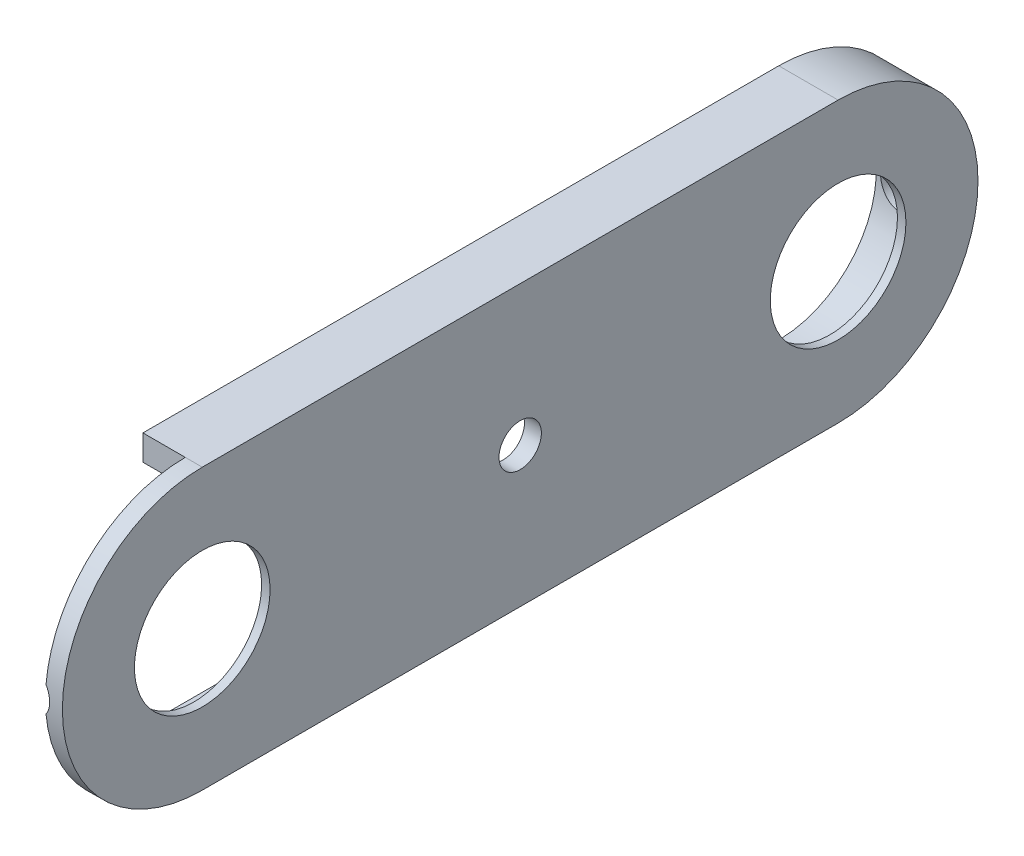
ISO-10303-21;
HEADER;
FILE_DESCRIPTION(('STEP AP214'),'2;1');
FILE_NAME('part.step','',(''),(''),'','','');
FILE_SCHEMA(('AUTOMOTIVE_DESIGN { 1 0 10303 214 1 1 1 1 }'));
ENDSEC;
DATA;
#1=APPLICATION_CONTEXT('core data for automotive mechanical design processes');
#2=APPLICATION_PROTOCOL_DEFINITION('international standard','automotive_design',2000,#1);
#3=PRODUCT_CONTEXT('',#1,'mechanical');
#4=PRODUCT('Part','Part','',(#3));
#5=PRODUCT_RELATED_PRODUCT_CATEGORY('part','',(#4));
#6=PRODUCT_DEFINITION_FORMATION('','',#4);
#7=PRODUCT_DEFINITION_CONTEXT('part definition',#1,'design');
#8=PRODUCT_DEFINITION('design','',#6,#7);
#9=PRODUCT_DEFINITION_SHAPE('','',#8);
#10=(LENGTH_UNIT() NAMED_UNIT(*) SI_UNIT(.MILLI.,.METRE.));
#11=(NAMED_UNIT(*) PLANE_ANGLE_UNIT() SI_UNIT($,.RADIAN.));
#12=(NAMED_UNIT(*) SI_UNIT($,.STERADIAN.) SOLID_ANGLE_UNIT());
#13=UNCERTAINTY_MEASURE_WITH_UNIT(LENGTH_MEASURE(1.E-05),#10,'distance_accuracy_value','');
#14=(GEOMETRIC_REPRESENTATION_CONTEXT(3) GLOBAL_UNCERTAINTY_ASSIGNED_CONTEXT((#13)) GLOBAL_UNIT_ASSIGNED_CONTEXT((#10,
#11,#12)) REPRESENTATION_CONTEXT('',''));
#15=CARTESIAN_POINT('',(0.,0.,0.));
#16=DIRECTION('',(0.,0.,1.));
#17=DIRECTION('',(1.,0.,0.));
#18=AXIS2_PLACEMENT_3D('',#15,#16,#17);
#19=CARTESIAN_POINT('',(-1.,0.,-37.5));
#20=DIRECTION('',(1.,0.,0.));
#21=DIRECTION('',(0.,0.,-1.));
#22=AXIS2_PLACEMENT_3D('',#19,#20,#21);
#23=CYLINDRICAL_SURFACE('',#22,16.5);
#24=CARTESIAN_POINT('',(-1.,0.,-37.5));
#25=DIRECTION('',(-1.,0.,0.));
#26=DIRECTION('',(0.,0.,1.));
#27=AXIS2_PLACEMENT_3D('',#24,#25,#26);
#28=CIRCLE('',#27,16.5);
#29=CARTESIAN_POINT('',(-1.,-13.5,-28.0131670194948));
#30=VERTEX_POINT('',#29);
#31=CARTESIAN_POINT('',(-1.,13.5,-28.0131670194949));
#32=VERTEX_POINT('',#31);
#33=EDGE_CURVE('E54',#30,#32,#28,.T.);
#34=ORIENTED_EDGE('',*,*,#33,.T.);
#35=DIRECTION('',(1.,0.,0.));
#36=VECTOR('',#35,1.);
#37=CARTESIAN_POINT('',(-1.,13.5,-28.0131670194949));
#38=LINE('',#37,#36);
#39=CARTESIAN_POINT('',(-6.,13.5,-28.0131670194949));
#40=VERTEX_POINT('',#39);
#41=EDGE_CURVE('E155',#32,#40,#38,.F.);
#42=ORIENTED_EDGE('',*,*,#41,.T.);
#43=CARTESIAN_POINT('',(-6.,0.,-37.5));
#44=DIRECTION('',(-1.,0.,0.));
#45=DIRECTION('',(0.,0.,-1.));
#46=AXIS2_PLACEMENT_3D('',#43,#44,#45);
#47=CIRCLE('',#46,16.5);
#48=CARTESIAN_POINT('',(-6.,-13.5,-28.0131670194948));
#49=VERTEX_POINT('',#48);
#50=EDGE_CURVE('E148',#49,#40,#47,.T.);
#51=ORIENTED_EDGE('',*,*,#50,.F.);
#52=DIRECTION('',(1.,0.,0.));
#53=VECTOR('',#52,1.);
#54=CARTESIAN_POINT('',(-1.,-13.5,-28.0131670194948));
#55=LINE('',#54,#53);
#56=EDGE_CURVE('E174',#49,#30,#55,.T.);
#57=ORIENTED_EDGE('',*,*,#56,.T.);
#58=EDGE_LOOP('',(#34,#42,#51,#57));
#59=FACE_BOUND('',#58,.T.);
#60=ADVANCED_FACE('F39',(#59),#23,.T.);
#61=CARTESIAN_POINT('',(-1.,0.,-37.5));
#62=DIRECTION('',(-1.,0.,0.));
#63=DIRECTION('',(0.,0.,1.));
#64=AXIS2_PLACEMENT_3D('',#61,#62,#63);
#65=PLANE('',#64);
#66=CARTESIAN_POINT('',(-1.,0.,0.));
#67=DIRECTION('',(-1.,0.,0.));
#68=DIRECTION('',(0.,0.,1.));
#69=AXIS2_PLACEMENT_3D('',#66,#67,#68);
#70=CIRCLE('',#69,2.5);
#71=CARTESIAN_POINT('',(-1.,0.,2.5));
#72=VERTEX_POINT('',#71);
#73=EDGE_CURVE('E181',#72,#72,#70,.T.);
#74=ORIENTED_EDGE('',*,*,#73,.F.);
#75=EDGE_LOOP('',(#74));
#76=FACE_BOUND('',#75,.T.);
#77=CARTESIAN_POINT('',(-1.,0.,37.5));
#78=DIRECTION('',(-1.,0.,0.));
#79=DIRECTION('',(0.,0.,1.));
#80=AXIS2_PLACEMENT_3D('',#77,#78,#79);
#81=CIRCLE('',#80,16.5);
#82=CARTESIAN_POINT('',(-1.,1.49999999999999,53.931676725155));
#83=VERTEX_POINT('',#82);
#84=CARTESIAN_POINT('',(-1.,16.5,37.5));
#85=VERTEX_POINT('',#84);
#86=EDGE_CURVE('E275',#83,#85,#81,.T.);
#87=ORIENTED_EDGE('',*,*,#86,.T.);
#88=DIRECTION('',(0.,1.,0.));
#89=VECTOR('',#88,1.);
#90=CARTESIAN_POINT('',(-1.,13.5,37.5));
#91=LINE('',#90,#89);
#92=CARTESIAN_POINT('',(-1.,13.5,37.5));
#93=VERTEX_POINT('',#92);
#94=EDGE_CURVE('E61',#93,#85,#91,.T.);
#95=ORIENTED_EDGE('',*,*,#94,.F.);
#96=DIRECTION('',(0.,0.,1.));
#97=VECTOR('',#96,1.);
#98=CARTESIAN_POINT('',(-1.,13.5,37.5));
#99=LINE('',#98,#97);
#100=EDGE_CURVE('E65',#32,#93,#99,.T.);
#101=ORIENTED_EDGE('',*,*,#100,.F.);
#102=ORIENTED_EDGE('',*,*,#33,.F.);
#103=DIRECTION('',(0.,0.,1.));
#104=VECTOR('',#103,1.);
#105=CARTESIAN_POINT('',(-1.,-13.5,37.5));
#106=LINE('',#105,#104);
#107=CARTESIAN_POINT('',(-1.,-13.5,37.5));
#108=VERTEX_POINT('',#107);
#109=EDGE_CURVE('E159',#30,#108,#106,.T.);
#110=ORIENTED_EDGE('',*,*,#109,.T.);
#111=DIRECTION('',(0.,-1.,0.));
#112=VECTOR('',#111,1.);
#113=CARTESIAN_POINT('',(-1.,-13.5,37.5));
#114=LINE('',#113,#112);
#115=CARTESIAN_POINT('',(-1.,-16.5,37.5));
#116=VERTEX_POINT('',#115);
#117=EDGE_CURVE('E167',#108,#116,#114,.T.);
#118=ORIENTED_EDGE('',*,*,#117,.T.);
#119=CARTESIAN_POINT('',(-1.,-1.50000000000001,53.931676725155));
#120=VERTEX_POINT('',#119);
#121=EDGE_CURVE('E270',#116,#120,#81,.T.);
#122=ORIENTED_EDGE('',*,*,#121,.T.);
#123=DIRECTION('',(0.,0.,1.));
#124=VECTOR('',#123,1.);
#125=CARTESIAN_POINT('',(-1.,-1.50000000000001,44.));
#126=LINE('',#125,#124);
#127=CARTESIAN_POINT('',(-1.,-1.50000000000001,48.9017542509914));
#128=VERTEX_POINT('',#127);
#129=EDGE_CURVE('E223',#128,#120,#126,.T.);
#130=ORIENTED_EDGE('',*,*,#129,.F.);
#131=CARTESIAN_POINT('',(-1.,0.,37.5));
#132=DIRECTION('',(-1.,0.,0.));
#133=DIRECTION('',(0.,0.,1.));
#134=AXIS2_PLACEMENT_3D('',#131,#132,#133);
#135=CIRCLE('',#134,11.5);
#136=CARTESIAN_POINT('',(-1.,1.49999999999999,48.9017542509914));
#137=VERTEX_POINT('',#136);
#138=EDGE_CURVE('E307',#137,#128,#135,.T.);
#139=ORIENTED_EDGE('',*,*,#138,.F.);
#140=DIRECTION('',(0.,0.,1.));
#141=VECTOR('',#140,1.);
#142=CARTESIAN_POINT('',(-1.,1.49999999999999,44.));
#143=LINE('',#142,#141);
#144=EDGE_CURVE('E190',#83,#137,#143,.F.);
#145=ORIENTED_EDGE('',*,*,#144,.F.);
#146=EDGE_LOOP('',(#87,#95,#101,#102,#110,#118,#122,#130,#139,#145));
#147=FACE_BOUND('',#146,.T.);
#148=ADVANCED_FACE('F243',(#76,#147),#65,.T.);
#149=CARTESIAN_POINT('',(-6.,16.5,-37.5));
#150=VERTEX_POINT('',#149);
#151=CARTESIAN_POINT('',(-6.,-16.5,-37.5));
#152=VERTEX_POINT('',#151);
#153=EDGE_CURVE('E257',#150,#152,#47,.T.);
#154=ORIENTED_EDGE('',*,*,#153,.F.);
#155=DIRECTION('',(1.,0.,0.));
#156=VECTOR('',#155,1.);
#157=CARTESIAN_POINT('',(-1.,16.5,-37.5));
#158=LINE('',#157,#156);
#159=CARTESIAN_POINT('',(1.,16.5,-37.5));
#160=VERTEX_POINT('',#159);
#161=EDGE_CURVE('E261',#150,#160,#158,.T.);
#162=ORIENTED_EDGE('',*,*,#161,.T.);
#163=CARTESIAN_POINT('',(1.,0.,-37.5));
#164=DIRECTION('',(1.,0.,0.));
#165=DIRECTION('',(0.,0.,-1.));
#166=AXIS2_PLACEMENT_3D('',#163,#164,#165);
#167=CIRCLE('',#166,16.5);
#168=CARTESIAN_POINT('',(1.,-16.5,-37.5));
#169=VERTEX_POINT('',#168);
#170=EDGE_CURVE('E293',#169,#160,#167,.T.);
#171=ORIENTED_EDGE('',*,*,#170,.F.);
#172=DIRECTION('',(1.,0.,0.));
#173=VECTOR('',#172,1.);
#174=CARTESIAN_POINT('',(-1.,-16.5,-37.5));
#175=LINE('',#174,#173);
#176=EDGE_CURVE('E263',#152,#169,#175,.T.);
#177=ORIENTED_EDGE('',*,*,#176,.F.);
#178=EDGE_LOOP('',(#154,#162,#171,#177));
#179=FACE_BOUND('',#178,.T.);
#180=CARTESIAN_POINT('',(-5.5,0.,-54.));
#181=CARTESIAN_POINT('',(-5.4999942572363,0.139568997452366,-53.9999977476528));
#182=CARTESIAN_POINT('',(-5.48827283785621,0.279218562999105,-53.9982105870402));
#183=CARTESIAN_POINT('',(-5.44170939028852,0.554613125820164,-53.9912532584451));
#184=CARTESIAN_POINT('',(-5.40684495841119,0.690354206485425,-53.9860798124227));
#185=CARTESIAN_POINT('',(-5.31506213885822,0.953906534647158,-53.9729311954606));
#186=CARTESIAN_POINT('',(-5.25816053949185,1.08172373291607,-53.9649581577308));
#187=CARTESIAN_POINT('',(-5.12395989708139,1.32597651388556,-53.9470909962824));
#188=CARTESIAN_POINT('',(-5.04666364327757,1.4424136499791,-53.9371971353109));
#189=CARTESIAN_POINT('',(-4.87321202367213,1.66154764510865,-53.9165001477212));
#190=CARTESIAN_POINT('',(-4.77692626445659,1.76414074029145,-53.9056910471797));
#191=CARTESIAN_POINT('',(-4.5685094321218,1.95177906511561,-53.8844285015251));
#192=CARTESIAN_POINT('',(-4.45637744082327,2.03682327721789,-53.8739750770647));
#193=CARTESIAN_POINT('',(-4.21875260905018,2.18735471298304,-53.8545494950682));
#194=CARTESIAN_POINT('',(-4.09319536151448,2.25274134816778,-53.8455850578477));
#195=CARTESIAN_POINT('',(-3.83272209459418,2.36145868570304,-53.8302341066754));
#196=CARTESIAN_POINT('',(-3.6978065962276,2.40479061482504,-53.8238474493412));
#197=CARTESIAN_POINT('',(-3.42353862923588,2.46784584311276,-53.8144339675493));
#198=CARTESIAN_POINT('',(-3.2842279161298,2.48774691974325,-53.8113818557403));
#199=CARTESIAN_POINT('',(-3.00421348508192,2.50392630256672,-53.8089062866292));
#200=CARTESIAN_POINT('',(-2.8635098492071,2.50020599229005,-53.8094826168053));
#201=CARTESIAN_POINT('',(-2.5859606207159,2.46939344901517,-53.8141756935549));
#202=CARTESIAN_POINT('',(-2.44909244963458,2.44249936435955,-53.8182624233836));
#203=CARTESIAN_POINT('',(-2.18183399736372,2.36641294577585,-53.8294689284976));
#204=CARTESIAN_POINT('',(-2.05144390294958,2.31721996934142,-53.8365887911774));
#205=CARTESIAN_POINT('',(-1.80024086434348,2.19772653963013,-53.8530924237126));
#206=CARTESIAN_POINT('',(-1.67946838888596,2.12734229942809,-53.8624851506325));
#207=CARTESIAN_POINT('',(-1.45137312485011,1.96752394760192,-53.8824697345079));
#208=CARTESIAN_POINT('',(-1.34405123741435,1.87808856069977,-53.8930616717158));
#209=CARTESIAN_POINT('',(-1.14475535435619,1.6816196910193,-53.9143837896878));
#210=CARTESIAN_POINT('',(-1.05294922327677,1.57441587736975,-53.9251142778832));
#211=CARTESIAN_POINT('',(-0.888605767714139,1.34603342177114,-53.9454040614798));
#212=CARTESIAN_POINT('',(-0.816068530737785,1.22485471636074,-53.954963351562));
#213=CARTESIAN_POINT('',(-0.692312719709886,0.971815721794951,-53.9718439483926));
#214=CARTESIAN_POINT('',(-0.641107260329662,0.839948920979357,-53.9791638776606));
#215=CARTESIAN_POINT('',(-0.561615330948155,0.569352134225966,-53.9907295183001));
#216=CARTESIAN_POINT('',(-0.533327279747371,0.430622622485678,-53.9949754417622));
#217=CARTESIAN_POINT('',(-0.500696752646798,0.151687057386773,-53.9998865423228));
#218=CARTESIAN_POINT('',(-0.496123526143796,0.0115085829881224,-54.0005862236411));
#219=CARTESIAN_POINT('',(-0.510439746372429,-0.267613344135319,-53.99841997884));
#220=CARTESIAN_POINT('',(-0.529328451567997,-0.406556835753097,-53.9955541654115));
#221=CARTESIAN_POINT('',(-0.589840469928919,-0.678564556456686,-53.9866002804077));
#222=CARTESIAN_POINT('',(-0.631351204939266,-0.811654400666293,-53.9805281695293));
#223=CARTESIAN_POINT('',(-0.735810114210089,-1.068985319601,-53.9658402835765));
#224=CARTESIAN_POINT('',(-0.79875931285276,-1.19322597114698,-53.9572243869563));
#225=CARTESIAN_POINT('',(-0.944848489983347,-1.43034535898606,-53.9383205169475));
#226=CARTESIAN_POINT('',(-1.02813464849603,-1.54313306605977,-53.9280206247268));
#227=CARTESIAN_POINT('',(-1.21233024823772,-1.75321276039239,-53.9069318528274));
#228=CARTESIAN_POINT('',(-1.3132407356299,-1.85050382712981,-53.8961429441494));
#229=CARTESIAN_POINT('',(-1.53084844946048,-2.02766949282495,-53.8751825194096));
#230=CARTESIAN_POINT('',(-1.64767236616349,-2.10738930198108,-53.8650170189504));
#231=CARTESIAN_POINT('',(-1.89318858259066,-2.24607312771053,-53.8465614341441));
#232=CARTESIAN_POINT('',(-2.02188055643501,-2.30503771397846,-53.8382712983238));
#233=CARTESIAN_POINT('',(-2.2870207267788,-2.40029812933786,-53.824548765394));
#234=CARTESIAN_POINT('',(-2.42343924331679,-2.43667503156285,-53.8191061589608));
#235=CARTESIAN_POINT('',(-2.70053813044287,-2.48598526128159,-53.8116678999976));
#236=CARTESIAN_POINT('',(-2.84121819949256,-2.49892024355462,-53.8096720041627));
#237=CARTESIAN_POINT('',(-3.12130372333183,-2.50093949887772,-53.8093623561848));
#238=CARTESIAN_POINT('',(-3.26070744269384,-2.49026717585729,-53.8110110265066));
#239=CARTESIAN_POINT('',(-3.53571292388188,-2.44589678006131,-53.8177230193832));
#240=CARTESIAN_POINT('',(-3.67131469229923,-2.41219874720726,-53.8227863360179));
#241=CARTESIAN_POINT('',(-3.93479725637777,-2.32282019861314,-53.8357438759955));
#242=CARTESIAN_POINT('',(-4.06268405670539,-2.2671570399103,-53.8436358636471));
#243=CARTESIAN_POINT('',(-4.30734302854094,-2.13545259703986,-53.8613641884847));
#244=CARTESIAN_POINT('',(-4.42411480811905,-2.05941059464868,-53.8712005941958));
#245=CARTESIAN_POINT('',(-4.64446507641858,-1.88822405811483,-53.8918301104082));
#246=CARTESIAN_POINT('',(-4.74790281870661,-1.79289935219715,-53.9026316636391));
#247=CARTESIAN_POINT('',(-4.93740004854685,-1.58623408357502,-53.9239042061856));
#248=CARTESIAN_POINT('',(-5.02345549413766,-1.47488980607091,-53.9343751181395));
#249=CARTESIAN_POINT('',(-5.1761785014693,-1.23860885534677,-53.9538739280201));
#250=CARTESIAN_POINT('',(-5.24273434386786,-1.11359928449035,-53.9628933823142));
#251=CARTESIAN_POINT('',(-5.35380463948338,-0.85409719580988,-53.9783903010556));
#252=CARTESIAN_POINT('',(-5.39834184517857,-0.719614631613493,-53.9848703880603));
#253=CARTESIAN_POINT('',(-5.45404467179081,-0.487113114828242,-53.9930848997806));
#254=CARTESIAN_POINT('',(-5.47125147372363,-0.390526922007692,-53.9956646973583));
#255=CARTESIAN_POINT('',(-5.49423108091855,-0.195973716996664,-53.9991230273835));
#256=CARTESIAN_POINT('',(-5.50000403262515,-0.0980067225076503,-54.0000015816204));
#257=CARTESIAN_POINT('',(-5.5,0.,-54.));
#258=B_SPLINE_CURVE_WITH_KNOTS('',3,(#180,#181,#182,#183,#184,#185,#186,#187,#188,#189,#190,
#191,#192,#193,#194,#195,#196,#197,#198,#199,#200,#201,#202,#203,#204,#205,#206,#207,#208,#209,
#210,#211,#212,#213,#214,#215,#216,#217,#218,#219,#220,#221,#222,#223,#224,#225,#226,#227,#228,
#229,#230,#231,#232,#233,#234,#235,#236,#237,#238,#239,#240,#241,#242,#243,#244,#245,#246,#247,
#248,#249,#250,#251,#252,#253,#254,#255,#256,#257),.UNSPECIFIED.,.T.,.F.,(4,2,2,2,2,2,2,2,2,2,2,
2,2,2,2,2,2,2,2,2,2,2,2,2,2,2,2,2,2,2,2,2,2,2,2,2,2,2,4),(0.,0.418348855154565,
0.837103286425347,1.25553932860404,1.67391817372421,2.09527670136871,2.51665965383641,
2.94016350706256,3.36364380072527,3.7838898713138,4.20411132785922,4.6207749206096,
5.03745051960789,5.45579571983414,5.87416893276729,6.29681313733767,6.7194592612518,
7.1423648438073,7.56524124526807,7.98399513729014,8.40273579454462,8.81941137619317,
9.23610687041355,9.65589057087304,10.0756991977627,10.4990700457283,10.9224292719976,
11.3442600315172,11.7660610125886,12.1835332910605,12.6010048457295,13.0181471691684,
13.4353041961335,13.8565557584487,14.2779051632636,14.701623409228,15.1249028952404,
15.4186753379532,15.7124440180106),.UNSPECIFIED.);
#259=CARTESIAN_POINT('',(-5.5,0.,-54.));
#260=VERTEX_POINT('',#259);
#261=EDGE_CURVE('E184',#260,#260,#258,.T.);
#262=ORIENTED_EDGE('',*,*,#261,.F.);
#263=EDGE_LOOP('',(#262));
#264=FACE_BOUND('',#263,.T.);
#265=ADVANCED_FACE('F41',(#179,#264),#23,.T.);
#266=CARTESIAN_POINT('',(-1.,0.,-37.5));
#267=DIRECTION('',(1.,0.,0.));
#268=DIRECTION('',(0.,0.,-1.));
#269=AXIS2_PLACEMENT_3D('',#266,#267,#268);
#270=CYLINDRICAL_SURFACE('',#269,11.5);
#271=CARTESIAN_POINT('',(-6.,0.,-37.5));
#272=DIRECTION('',(-1.,0.,0.));
#273=DIRECTION('',(0.,0.,1.));
#274=AXIS2_PLACEMENT_3D('',#271,#272,#273);
#275=CIRCLE('',#274,11.5);
#276=CARTESIAN_POINT('',(-6.,0.,-26.));
#277=VERTEX_POINT('',#276);
#278=EDGE_CURVE('E222',#277,#277,#275,.T.);
#279=ORIENTED_EDGE('',*,*,#278,.T.);
#280=EDGE_LOOP('',(#279));
#281=FACE_BOUND('',#280,.T.);
#282=CARTESIAN_POINT('',(0.,0.,-37.5));
#283=DIRECTION('',(-1.,0.,0.));
#284=DIRECTION('',(0.,0.,1.));
#285=AXIS2_PLACEMENT_3D('',#282,#283,#284);
#286=CIRCLE('',#285,11.5);
#287=CARTESIAN_POINT('',(0.,0.,-26.));
#288=VERTEX_POINT('',#287);
#289=EDGE_CURVE('E303',#288,#288,#286,.T.);
#290=ORIENTED_EDGE('',*,*,#289,.F.);
#291=EDGE_LOOP('',(#290));
#292=FACE_BOUND('',#291,.T.);
#293=CARTESIAN_POINT('',(-5.5,0.,-49.));
#294=CARTESIAN_POINT('',(-5.49999523494069,0.138677726510846,-48.9999974393954));
#295=CARTESIAN_POINT('',(-5.48842213463175,0.277413225798972,-48.9974660329192));
#296=CARTESIAN_POINT('',(-5.44248273452923,0.550944911814615,-48.9876122322648));
#297=CARTESIAN_POINT('',(-5.40810001235691,0.685738187177276,-48.9802863862567));
#298=CARTESIAN_POINT('',(-5.31766803793991,0.947392658892464,-48.9616595565263));
#299=CARTESIAN_POINT('',(-5.26164127977798,1.07426193195674,-48.9503627008652));
#300=CARTESIAN_POINT('',(-5.12958268035959,1.31679476574257,-48.9250137521665));
#301=CARTESIAN_POINT('',(-5.05355140618513,1.43245864398414,-48.9109617372342));
#302=CARTESIAN_POINT('',(-4.88236557894334,1.65113687017524,-48.8813931566709));
#303=CARTESIAN_POINT('',(-4.78695454047447,1.7539480226285,-48.8658586111771));
#304=CARTESIAN_POINT('',(-4.58026823483503,1.94224066057477,-48.8352028008011));
#305=CARTESIAN_POINT('',(-4.46899156829011,2.02772061581533,-48.8200815725146));
#306=CARTESIAN_POINT('',(-4.23223337862382,2.17981857275251,-48.7917873272943));
#307=CARTESIAN_POINT('',(-4.10661017052634,2.24622069514281,-48.7786373565009));
#308=CARTESIAN_POINT('',(-3.84565523667896,2.35689344435894,-48.7560323824766));
#309=CARTESIAN_POINT('',(-3.71032465874524,2.40116668282572,-48.7465769432475));
#310=CARTESIAN_POINT('',(-3.43599938442598,2.46565424770195,-48.7326146337362));
#311=CARTESIAN_POINT('',(-3.29709304326436,2.48622809682875,-48.7280338974079));
#312=CARTESIAN_POINT('',(-3.01773058213711,2.50385066868686,-48.724117758739));
#313=CARTESIAN_POINT('',(-2.87727465233032,2.50090224659726,-48.7247817197868));
#314=CARTESIAN_POINT('',(-2.60146966696417,2.47185339460594,-48.7312130658968));
#315=CARTESIAN_POINT('',(-2.46607419641681,2.44617020684332,-48.7368884732507));
#316=CARTESIAN_POINT('',(-2.20156088300032,2.37304173275475,-48.7525578586621));
#317=CARTESIAN_POINT('',(-2.07244338892178,2.32559523883172,-48.7625520763589));
#318=CARTESIAN_POINT('',(-1.82297605607061,2.20990273661165,-48.7858238749824));
#319=CARTESIAN_POINT('',(-1.70270324141853,2.14149592741319,-48.799126684358));
#320=CARTESIAN_POINT('',(-1.47518910877612,1.98593770795307,-48.8275012480038));
#321=CARTESIAN_POINT('',(-1.36794954970688,1.89878377203338,-48.8425732404982));
#322=CARTESIAN_POINT('',(-1.16714347213638,1.70599474463954,-48.8731828590882));
#323=CARTESIAN_POINT('',(-1.07391781330583,1.60000476027814,-48.8887235557419));
#324=CARTESIAN_POINT('',(-0.906509659135693,1.37371962098244,-48.9182263347737));
#325=CARTESIAN_POINT('',(-0.832327500647488,1.25342421306141,-48.9321883892255));
#326=CARTESIAN_POINT('',(-0.705029453344621,1.00152969205098,-48.9570051935705));
#327=CARTESIAN_POINT('',(-0.651957806859073,0.869907535370165,-48.9678534045306));
#328=CARTESIAN_POINT('',(-0.568779226409146,0.599325426676384,-48.9851715489049));
#329=CARTESIAN_POINT('',(-0.538668994554443,0.460366531487377,-48.9916421110548));
#330=CARTESIAN_POINT('',(-0.502762761776951,0.181979668046687,-48.9993865515895));
#331=CARTESIAN_POINT('',(-0.49650108001959,0.0426144524251206,-49.0007599464758));
#332=CARTESIAN_POINT('',(-0.507208085243221,-0.2351706651068,-48.9984339982112));
#333=CARTESIAN_POINT('',(-0.52417521678492,-0.373590629688975,-48.9947349947164));
#334=CARTESIAN_POINT('',(-0.580472011817674,-0.644016073384047,-48.9827426393966));
#335=CARTESIAN_POINT('',(-0.619557816836417,-0.776074738455781,-48.974499412859));
#336=CARTESIAN_POINT('',(-0.718712094390643,-1.03176169777679,-48.9543411035207));
#337=CARTESIAN_POINT('',(-0.778782339473739,-1.15538927880089,-48.9424257105435));
#338=CARTESIAN_POINT('',(-0.919173336488136,-1.39263316867793,-48.9159991010029));
#339=CARTESIAN_POINT('',(-0.999768162646761,-1.50608338755975,-48.9014535932093));
#340=CARTESIAN_POINT('',(-1.17855917395209,-1.71801618519105,-48.8714509636298));
#341=CARTESIAN_POINT('',(-1.27675761530829,-1.81649684233745,-48.8559937251605));
#342=CARTESIAN_POINT('',(-1.49010405467798,-1.99753288574289,-48.825566641818));
#343=CARTESIAN_POINT('',(-1.60552787262532,-2.07976600786433,-48.810610776988));
#344=CARTESIAN_POINT('',(-1.84882151902335,-2.22368179366392,-48.7832011420601));
#345=CARTESIAN_POINT('',(-1.97669081094422,-2.2853653427365,-48.7707472641715));
#346=CARTESIAN_POINT('',(-2.24056216950365,-2.38601708061677,-48.7498696486682));
#347=CARTESIAN_POINT('',(-2.37651388040793,-2.42511238575492,-48.7414234069624));
#348=CARTESIAN_POINT('',(-2.65326393460487,-2.47985131583717,-48.7294762446113));
#349=CARTESIAN_POINT('',(-2.7940615101344,-2.49549863846582,-48.7259745442301));
#350=CARTESIAN_POINT('',(-3.07325831791543,-2.50274155792605,-48.7243616472795));
#351=CARTESIAN_POINT('',(-3.21164388207539,-2.49484798386679,-48.7261359606195));
#352=CARTESIAN_POINT('',(-3.48506257440381,-2.45637409896548,-48.7346164742396));
#353=CARTESIAN_POINT('',(-3.62009574106628,-2.42579404874617,-48.7413226178626));
#354=CARTESIAN_POINT('',(-3.88257674431773,-2.34306069762794,-48.7588557046026));
#355=CARTESIAN_POINT('',(-4.0100487415331,-2.2909808755088,-48.7696686022834));
#356=CARTESIAN_POINT('',(-4.25452202840861,-2.16678978132846,-48.7942025369604));
#357=CARTESIAN_POINT('',(-4.37152224091074,-2.09467645168668,-48.8079238726391));
#358=CARTESIAN_POINT('',(-4.59425083236039,-1.93076731772527,-48.8370712566148));
#359=CARTESIAN_POINT('',(-4.69970734417471,-1.83860709857685,-48.8525258838354));
#360=CARTESIAN_POINT('',(-4.89382607594413,-1.63795982288562,-48.8832055192048));
#361=CARTESIAN_POINT('',(-4.98248441057393,-1.52946899955169,-48.8984304734839));
#362=CARTESIAN_POINT('',(-5.14157383582102,-1.29756952312689,-48.9271660141609));
#363=CARTESIAN_POINT('',(-5.21175748905955,-1.17398793223283,-48.9406522029584));
#364=CARTESIAN_POINT('',(-5.33024581960981,-0.916515832604882,-48.9641462926135));
#365=CARTESIAN_POINT('',(-5.37856894784688,-0.782634129577186,-48.9741571251076));
#366=CARTESIAN_POINT('',(-5.44329680567228,-0.540505002079868,-48.9877745785232));
#367=CARTESIAN_POINT('',(-5.46452013128871,-0.433572829583115,-48.9923308317923));
#368=CARTESIAN_POINT('',(-5.49287329436757,-0.217772258186681,-48.9984444830369));
#369=CARTESIAN_POINT('',(-5.50000374201223,-0.108903943322497,-49.0000020108488));
#370=CARTESIAN_POINT('',(-5.5,0.,-49.));
#371=B_SPLINE_CURVE_WITH_KNOTS('',3,(#293,#294,#295,#296,#297,#298,#299,#300,#301,#302,#303,
#304,#305,#306,#307,#308,#309,#310,#311,#312,#313,#314,#315,#316,#317,#318,#319,#320,#321,#322,
#323,#324,#325,#326,#327,#328,#329,#330,#331,#332,#333,#334,#335,#336,#337,#338,#339,#340,#341,
#342,#343,#344,#345,#346,#347,#348,#349,#350,#351,#352,#353,#354,#355,#356,#357,#358,#359,#360,
#361,#362,#363,#364,#365,#366,#367,#368,#369,#370),.UNSPECIFIED.,.T.,.F.,(4,2,2,2,2,2,2,2,2,2,2,
2,2,2,2,2,2,2,2,2,2,2,2,2,2,2,2,2,2,2,2,2,2,2,2,2,2,2,4),(0.,0.415634564336815,
0.831568700793521,1.24707172561509,1.66256297315069,2.08396070666695,2.50539563117213,
2.93142680189745,3.35740768073597,3.77683755102814,4.19621651088048,4.60805475084517,
5.01991584555554,5.43501926087916,5.85017863499904,6.27420298213809,6.69823482912454,
7.12315071646025,7.54800556269352,7.96452059893772,8.38100774601865,8.79299016056121,
9.20500738351862,9.62284481100338,10.0407358299606,10.4662282557997,10.8917023465929,
11.3147581376294,11.7377472068679,12.151624822884,12.5654976843385,12.9779676302157,
13.390479955298,13.8112329668628,14.2320831777846,14.6583121167758,15.0841806317309,
15.4105935613292,15.73699235785),.UNSPECIFIED.);
#372=CARTESIAN_POINT('',(-5.5,0.,-49.));
#373=VERTEX_POINT('',#372);
#374=EDGE_CURVE('E44',#373,#373,#371,.T.);
#375=ORIENTED_EDGE('',*,*,#374,.T.);
#376=EDGE_LOOP('',(#375));
#377=FACE_BOUND('',#376,.T.);
#378=ADVANCED_FACE('F234',(#281,#292,#377),#270,.F.);
#379=CARTESIAN_POINT('',(-1.,-16.5,-37.5));
#380=DIRECTION('',(0.,1.,0.));
#381=DIRECTION('',(0.,0.,1.));
#382=AXIS2_PLACEMENT_3D('',#379,#380,#381);
#383=PLANE('',#382);
#384=ORIENTED_EDGE('',*,*,#176,.T.);
#385=DIRECTION('',(0.,0.,-1.));
#386=VECTOR('',#385,1.);
#387=CARTESIAN_POINT('',(1.,-16.5,37.5));
#388=LINE('',#387,#386);
#389=CARTESIAN_POINT('',(1.,-16.5,37.5));
#390=VERTEX_POINT('',#389);
#391=EDGE_CURVE('E301',#390,#169,#388,.T.);
#392=ORIENTED_EDGE('',*,*,#391,.F.);
#393=DIRECTION('',(1.,0.,0.));
#394=VECTOR('',#393,1.);
#395=CARTESIAN_POINT('',(-1.,-16.5,37.5));
#396=LINE('',#395,#394);
#397=EDGE_CURVE('E272',#116,#390,#396,.T.);
#398=ORIENTED_EDGE('',*,*,#397,.F.);
#399=DIRECTION('',(-1.,0.,0.));
#400=VECTOR('',#399,1.);
#401=CARTESIAN_POINT('',(-1.,-16.5,37.5));
#402=LINE('',#401,#400);
#403=CARTESIAN_POINT('',(-6.,-16.5,37.5));
#404=VERTEX_POINT('',#403);
#405=EDGE_CURVE('E158',#116,#404,#402,.T.);
#406=ORIENTED_EDGE('',*,*,#405,.T.);
#407=DIRECTION('',(0.,0.,-1.));
#408=VECTOR('',#407,1.);
#409=CARTESIAN_POINT('',(-6.,-16.5,37.5));
#410=LINE('',#409,#408);
#411=EDGE_CURVE('E162',#404,#152,#410,.T.);
#412=ORIENTED_EDGE('',*,*,#411,.T.);
#413=EDGE_LOOP('',(#384,#392,#398,#406,#412));
#414=FACE_BOUND('',#413,.T.);
#415=ADVANCED_FACE('F230',(#414),#383,.F.);
#416=CARTESIAN_POINT('',(-1.,0.,37.5));
#417=DIRECTION('',(1.,0.,0.));
#418=DIRECTION('',(0.,0.,-1.));
#419=AXIS2_PLACEMENT_3D('',#416,#417,#418);
#420=CYLINDRICAL_SURFACE('',#419,16.5);
#421=ORIENTED_EDGE('',*,*,#86,.F.);
#422=CARTESIAN_POINT('',(-1.,1.49999999999999,53.931676725155));
#423=CARTESIAN_POINT('',(-0.958043236503979,1.44406823161597,53.9367847242388));
#424=CARTESIAN_POINT('',(-0.918438470805411,1.38636261476401,53.941762481247));
#425=CARTESIAN_POINT('',(-0.844184058788926,1.26780998175513,53.9513274895686));
#426=CARTESIAN_POINT('',(-0.809534792389235,1.20696272522751,53.9559147109303));
#427=CARTESIAN_POINT('',(-0.745475832155907,1.08259388150965,53.9645641820903));
#428=CARTESIAN_POINT('',(-0.71606177679017,1.01907457551408,53.9686268681045));
#429=CARTESIAN_POINT('',(-0.662655228978226,0.889784635140983,53.9761186387628));
#430=CARTESIAN_POINT('',(-0.638662181921425,0.82401423186141,53.979547788216));
#431=CARTESIAN_POINT('',(-0.578658432326006,0.635207732990263,53.9882196069889));
#432=CARTESIAN_POINT('',(-0.549211970659786,0.509969171209201,53.9926037501661));
#433=CARTESIAN_POINT('',(-0.509884026072218,0.256495189217416,53.9984940243546));
#434=CARTESIAN_POINT('',(-0.499995781385175,0.128260820251451,54.0000011500167));
#435=CARTESIAN_POINT('',(-0.500004592168658,-0.139618178688662,53.9999987481505));
#436=CARTESIAN_POINT('',(-0.511731147671445,-0.27926770053111,53.9982102819677));
#437=CARTESIAN_POINT('',(-0.558300080267756,-0.554643526989207,53.9912515523376));
#438=CARTESIAN_POINT('',(-0.593158202707852,-0.690367093543215,53.9860789854122));
#439=CARTESIAN_POINT('',(-0.68138508601964,-0.943701307303994,53.9734405036184));
#440=CARTESIAN_POINT('',(-0.733095918533016,-1.06189876078266,53.9661852015175));
#441=CARTESIAN_POINT('',(-0.823688287245206,-1.23199244953415,53.954040406207));
#442=CARTESIAN_POINT('',(-0.856056322765056,-1.28748934230919,53.9497818894977));
#443=CARTESIAN_POINT('',(-0.924953319114893,-1.39581465794437,53.9409444576576));
#444=CARTESIAN_POINT('',(-0.961482491317521,-1.44864294505082,53.9363655262552));
#445=CARTESIAN_POINT('',(-1.,-1.50000000000001,53.931676725155));
#446=B_SPLINE_CURVE_WITH_KNOTS('',3,(#422,#423,#424,#425,#426,#427,#428,#429,#430,#431,#432,
#433,#434,#435,#436,#437,#438,#439,#440,#441,#442,#443,#444,#445),.UNSPECIFIED.,.F.,.F.,(4,2,2,
2,2,2,2,2,2,2,2,4),(0.,0.210252469290647,0.420521049162741,0.630613622706148,0.840684692430633,
1.22519090257139,1.60956415602862,2.02797324992905,2.44666744181691,2.83266814472569,
3.02566412107014,3.21866990537779),.UNSPECIFIED.);
#447=EDGE_CURVE('E215',#83,#120,#446,.T.);
#448=ORIENTED_EDGE('',*,*,#447,.T.);
#449=ORIENTED_EDGE('',*,*,#121,.F.);
#450=ORIENTED_EDGE('',*,*,#397,.T.);
#451=CARTESIAN_POINT('',(1.,0.,37.5));
#452=DIRECTION('',(1.,0.,0.));
#453=DIRECTION('',(0.,0.,-1.));
#454=AXIS2_PLACEMENT_3D('',#451,#452,#453);
#455=CIRCLE('',#454,16.5);
#456=CARTESIAN_POINT('',(1.,16.5,37.5));
#457=VERTEX_POINT('',#456);
#458=EDGE_CURVE('E298',#457,#390,#455,.T.);
#459=ORIENTED_EDGE('',*,*,#458,.F.);
#460=DIRECTION('',(1.,0.,0.));
#461=VECTOR('',#460,1.);
#462=CARTESIAN_POINT('',(-1.,16.5,37.5));
#463=LINE('',#462,#461);
#464=EDGE_CURVE('E269',#85,#457,#463,.T.);
#465=ORIENTED_EDGE('',*,*,#464,.F.);
#466=EDGE_LOOP('',(#421,#448,#449,#450,#459,#465));
#467=FACE_BOUND('',#466,.T.);
#468=ADVANCED_FACE('F225',(#467),#420,.T.);
#469=CARTESIAN_POINT('',(-1.,16.5,-37.5));
#470=DIRECTION('',(0.,-1.,0.));
#471=DIRECTION('',(0.,0.,-1.));
#472=AXIS2_PLACEMENT_3D('',#469,#470,#471);
#473=PLANE('',#472);
#474=ORIENTED_EDGE('',*,*,#464,.T.);
#475=DIRECTION('',(0.,0.,1.));
#476=VECTOR('',#475,1.);
#477=CARTESIAN_POINT('',(1.,16.5,-37.5));
#478=LINE('',#477,#476);
#479=EDGE_CURVE('E267',#160,#457,#478,.T.);
#480=ORIENTED_EDGE('',*,*,#479,.F.);
#481=ORIENTED_EDGE('',*,*,#161,.F.);
#482=DIRECTION('',(0.,0.,-1.));
#483=VECTOR('',#482,1.);
#484=CARTESIAN_POINT('',(-6.,16.5,37.5));
#485=LINE('',#484,#483);
#486=CARTESIAN_POINT('',(-6.,16.5,37.5));
#487=VERTEX_POINT('',#486);
#488=EDGE_CURVE('E152',#487,#150,#485,.T.);
#489=ORIENTED_EDGE('',*,*,#488,.F.);
#490=DIRECTION('',(-1.,0.,0.));
#491=VECTOR('',#490,1.);
#492=CARTESIAN_POINT('',(-1.,16.5,37.5));
#493=LINE('',#492,#491);
#494=EDGE_CURVE('E139',#85,#487,#493,.T.);
#495=ORIENTED_EDGE('',*,*,#494,.F.);
#496=EDGE_LOOP('',(#474,#480,#481,#489,#495));
#497=FACE_BOUND('',#496,.T.);
#498=ADVANCED_FACE('F229',(#497),#473,.F.);
#499=CARTESIAN_POINT('',(-1.,0.,37.5));
#500=DIRECTION('',(1.,0.,0.));
#501=DIRECTION('',(0.,0.,-1.));
#502=AXIS2_PLACEMENT_3D('',#499,#500,#501);
#503=CYLINDRICAL_SURFACE('',#502,11.5);
#504=CARTESIAN_POINT('',(-1.,1.49999999999999,48.9017542509914));
#505=CARTESIAN_POINT('',(-0.958310899006862,1.44441220957512,48.909068204031));
#506=CARTESIAN_POINT('',(-0.918945586453826,1.38709633572446,48.9161935345548));
#507=CARTESIAN_POINT('',(-0.845093087546672,1.26933579130058,48.9298863995893));
#508=CARTESIAN_POINT('',(-0.810606209738207,1.20889092315827,48.9364538988084));
#509=CARTESIAN_POINT('',(-0.714855453680181,1.02344012901295,48.9550398753771));
#510=CARTESIAN_POINT('',(-0.661250136597802,0.894249532367522,48.9659511758814));
#511=CARTESIAN_POINT('',(-0.576237241760256,0.628403938762188,48.9835918793588));
#512=CARTESIAN_POINT('',(-0.544851754019787,0.491741658720796,48.990317119928));
#513=CARTESIAN_POINT('',(-0.505351576988069,0.215020655230268,48.9988213389508));
#514=CARTESIAN_POINT('',(-0.497219448575773,0.0749645565563675,49.0006040240994));
#515=CARTESIAN_POINT('',(-0.504408791601707,-0.202570414555329,48.9990420624589));
#516=CARTESIAN_POINT('',(-0.519408835454327,-0.340058218213022,48.9957676839556));
#517=CARTESIAN_POINT('',(-0.571792895831139,-0.610572920004494,48.984578276339));
#518=CARTESIAN_POINT('',(-0.609187847031189,-0.743597605419963,48.9766609802852));
#519=CARTESIAN_POINT('',(-0.699034921413499,-0.98485206513163,48.9583064320703));
#520=CARTESIAN_POINT('',(-0.74893422415527,-1.09407125857565,48.9483238187884));
#521=CARTESIAN_POINT('',(-0.834950886032945,-1.25145542802612,48.931826255262));
#522=CARTESIAN_POINT('',(-0.865472429931627,-1.30282675842697,48.9260752845494));
#523=CARTESIAN_POINT('',(-0.930091670120862,-1.40322548848979,48.9141804328814));
#524=CARTESIAN_POINT('',(-0.964189568638501,-1.45225275537684,48.9080365297149));
#525=CARTESIAN_POINT('',(-1.,-1.50000000000001,48.9017542509914));
#526=B_SPLINE_CURVE_WITH_KNOTS('',3,(#504,#505,#506,#507,#508,#509,#510,#511,#512,#513,#514,
#515,#516,#517,#518,#519,#520,#521,#522,#523,#524,#525),.UNSPECIFIED.,.F.,.F.,(4,2,2,2,2,2,2,2,
2,2,4),(0.,0.209478675176845,0.418970593302954,0.837699409106452,1.25684392504052,
1.67567401623285,2.0887365741673,2.50200098120147,2.86215255133374,3.04210911585093,
3.22207586161005),.UNSPECIFIED.);
#527=EDGE_CURVE('E11',#137,#128,#526,.T.);
#528=ORIENTED_EDGE('',*,*,#527,.F.);
#529=ORIENTED_EDGE('',*,*,#138,.T.);
#530=EDGE_LOOP('',(#528,#529));
#531=FACE_BOUND('',#530,.T.);
#532=CARTESIAN_POINT('',(0.,0.,37.5));
#533=DIRECTION('',(-1.,0.,0.));
#534=DIRECTION('',(0.,0.,1.));
#535=AXIS2_PLACEMENT_3D('',#532,#533,#534);
#536=CIRCLE('',#535,11.5);
#537=CARTESIAN_POINT('',(0.,0.,49.));
#538=VERTEX_POINT('',#537);
#539=EDGE_CURVE('E306',#538,#538,#536,.T.);
#540=ORIENTED_EDGE('',*,*,#539,.F.);
#541=EDGE_LOOP('',(#540));
#542=FACE_BOUND('',#541,.T.);
#543=ADVANCED_FACE('F314',(#531,#542),#503,.F.);
#544=CARTESIAN_POINT('',(0.,0.,-37.5));
#545=DIRECTION('',(1.,0.,0.));
#546=DIRECTION('',(0.,0.,-1.));
#547=AXIS2_PLACEMENT_3D('',#544,#545,#546);
#548=PLANE('',#547);
#549=CARTESIAN_POINT('',(0.,0.,37.5));
#550=DIRECTION('',(1.,0.,0.));
#551=DIRECTION('',(0.,0.,-1.));
#552=AXIS2_PLACEMENT_3D('',#549,#550,#551);
#553=CIRCLE('',#552,8.);
#554=CARTESIAN_POINT('',(0.,0.,29.5));
#555=VERTEX_POINT('',#554);
#556=EDGE_CURVE('E286',#555,#555,#553,.T.);
#557=ORIENTED_EDGE('',*,*,#556,.T.);
#558=EDGE_LOOP('',(#557));
#559=FACE_BOUND('',#558,.T.);
#560=ORIENTED_EDGE('',*,*,#539,.T.);
#561=EDGE_LOOP('',(#560));
#562=FACE_BOUND('',#561,.T.);
#563=ADVANCED_FACE('F312',(#559,#562),#548,.F.);
#564=CARTESIAN_POINT('',(0.,0.,-37.5));
#565=DIRECTION('',(1.,0.,0.));
#566=DIRECTION('',(0.,0.,-1.));
#567=AXIS2_PLACEMENT_3D('',#564,#565,#566);
#568=CIRCLE('',#567,8.);
#569=CARTESIAN_POINT('',(0.,0.,-45.5));
#570=VERTEX_POINT('',#569);
#571=EDGE_CURVE('E287',#570,#570,#568,.T.);
#572=ORIENTED_EDGE('',*,*,#571,.T.);
#573=EDGE_LOOP('',(#572));
#574=FACE_BOUND('',#573,.T.);
#575=ORIENTED_EDGE('',*,*,#289,.T.);
#576=EDGE_LOOP('',(#575));
#577=FACE_BOUND('',#576,.T.);
#578=ADVANCED_FACE('F321',(#574,#577),#548,.F.);
#579=CARTESIAN_POINT('',(1.,0.,-37.5));
#580=DIRECTION('',(1.,0.,0.));
#581=DIRECTION('',(0.,0.,-1.));
#582=AXIS2_PLACEMENT_3D('',#579,#580,#581);
#583=PLANE('',#582);
#584=CARTESIAN_POINT('',(1.,0.,0.));
#585=DIRECTION('',(1.,0.,0.));
#586=DIRECTION('',(0.,0.,-1.));
#587=AXIS2_PLACEMENT_3D('',#584,#585,#586);
#588=CIRCLE('',#587,2.5);
#589=CARTESIAN_POINT('',(1.,0.,-2.5));
#590=VERTEX_POINT('',#589);
#591=EDGE_CURVE('E178',#590,#590,#588,.T.);
#592=ORIENTED_EDGE('',*,*,#591,.F.);
#593=EDGE_LOOP('',(#592));
#594=FACE_BOUND('',#593,.T.);
#595=CARTESIAN_POINT('',(1.,0.,37.5));
#596=DIRECTION('',(1.,0.,0.));
#597=DIRECTION('',(0.,0.,-1.));
#598=AXIS2_PLACEMENT_3D('',#595,#596,#597);
#599=CIRCLE('',#598,8.);
#600=CARTESIAN_POINT('',(1.,0.,29.5));
#601=VERTEX_POINT('',#600);
#602=EDGE_CURVE('E290',#601,#601,#599,.T.);
#603=ORIENTED_EDGE('',*,*,#602,.F.);
#604=EDGE_LOOP('',(#603));
#605=FACE_BOUND('',#604,.T.);
#606=ORIENTED_EDGE('',*,*,#170,.T.);
#607=ORIENTED_EDGE('',*,*,#479,.T.);
#608=ORIENTED_EDGE('',*,*,#458,.T.);
#609=ORIENTED_EDGE('',*,*,#391,.T.);
#610=EDGE_LOOP('',(#606,#607,#608,#609));
#611=FACE_BOUND('',#610,.T.);
#612=CARTESIAN_POINT('',(1.,0.,-37.5));
#613=DIRECTION('',(1.,0.,0.));
#614=DIRECTION('',(0.,0.,-1.));
#615=AXIS2_PLACEMENT_3D('',#612,#613,#614);
#616=CIRCLE('',#615,8.);
#617=CARTESIAN_POINT('',(1.,0.,-45.5));
#618=VERTEX_POINT('',#617);
#619=EDGE_CURVE('E283',#618,#618,#616,.T.);
#620=ORIENTED_EDGE('',*,*,#619,.F.);
#621=EDGE_LOOP('',(#620));
#622=FACE_BOUND('',#621,.T.);
#623=ADVANCED_FACE('F329',(#594,#605,#611,#622),#583,.T.);
#624=CARTESIAN_POINT('',(1.,0.,37.5));
#625=DIRECTION('',(-1.,0.,0.));
#626=DIRECTION('',(0.,0.,1.));
#627=AXIS2_PLACEMENT_3D('',#624,#625,#626);
#628=CYLINDRICAL_SURFACE('',#627,8.);
#629=ORIENTED_EDGE('',*,*,#602,.T.);
#630=EDGE_LOOP('',(#629));
#631=FACE_BOUND('',#630,.T.);
#632=ORIENTED_EDGE('',*,*,#556,.F.);
#633=EDGE_LOOP('',(#632));
#634=FACE_BOUND('',#633,.T.);
#635=ADVANCED_FACE('F332',(#631,#634),#628,.F.);
#636=CARTESIAN_POINT('',(1.,0.,-37.5));
#637=DIRECTION('',(-1.,0.,0.));
#638=DIRECTION('',(0.,0.,1.));
#639=AXIS2_PLACEMENT_3D('',#636,#637,#638);
#640=CYLINDRICAL_SURFACE('',#639,8.);
#641=ORIENTED_EDGE('',*,*,#619,.T.);
#642=EDGE_LOOP('',(#641));
#643=FACE_BOUND('',#642,.T.);
#644=ORIENTED_EDGE('',*,*,#571,.F.);
#645=EDGE_LOOP('',(#644));
#646=FACE_BOUND('',#645,.T.);
#647=ADVANCED_FACE('F335',(#643,#646),#640,.F.);
#648=CARTESIAN_POINT('',(-6.,0.,-37.5));
#649=DIRECTION('',(1.,0.,0.));
#650=DIRECTION('',(0.,0.,-1.));
#651=AXIS2_PLACEMENT_3D('',#648,#649,#650);
#652=PLANE('',#651);
#653=ORIENTED_EDGE('',*,*,#50,.T.);
#654=DIRECTION('',(0.,0.,-1.));
#655=VECTOR('',#654,1.);
#656=CARTESIAN_POINT('',(-6.,13.5,37.5));
#657=LINE('',#656,#655);
#658=CARTESIAN_POINT('',(-6.,13.5,37.5));
#659=VERTEX_POINT('',#658);
#660=EDGE_CURVE('E132',#659,#40,#657,.T.);
#661=ORIENTED_EDGE('',*,*,#660,.F.);
#662=DIRECTION('',(0.,1.,0.));
#663=VECTOR('',#662,1.);
#664=CARTESIAN_POINT('',(-6.,13.5,37.5));
#665=LINE('',#664,#663);
#666=EDGE_CURVE('E134',#659,#487,#665,.T.);
#667=ORIENTED_EDGE('',*,*,#666,.T.);
#668=ORIENTED_EDGE('',*,*,#488,.T.);
#669=ORIENTED_EDGE('',*,*,#153,.T.);
#670=ORIENTED_EDGE('',*,*,#411,.F.);
#671=DIRECTION('',(0.,-1.,0.));
#672=VECTOR('',#671,1.);
#673=CARTESIAN_POINT('',(-6.,-13.5,37.5));
#674=LINE('',#673,#672);
#675=CARTESIAN_POINT('',(-6.,-13.5,37.5));
#676=VERTEX_POINT('',#675);
#677=EDGE_CURVE('E172',#676,#404,#674,.T.);
#678=ORIENTED_EDGE('',*,*,#677,.F.);
#679=DIRECTION('',(0.,0.,-1.));
#680=VECTOR('',#679,1.);
#681=CARTESIAN_POINT('',(-6.,-13.5,37.5));
#682=LINE('',#681,#680);
#683=EDGE_CURVE('E165',#676,#49,#682,.T.);
#684=ORIENTED_EDGE('',*,*,#683,.T.);
#685=EDGE_LOOP('',(#653,#661,#667,#668,#669,#670,#678,#684));
#686=FACE_BOUND('',#685,.T.);
#687=ORIENTED_EDGE('',*,*,#278,.F.);
#688=EDGE_LOOP('',(#687));
#689=FACE_BOUND('',#688,.T.);
#690=ADVANCED_FACE('F145',(#686,#689),#652,.F.);
#691=CARTESIAN_POINT('',(-3.,0.,44.));
#692=DIRECTION('',(0.,0.,1.));
#693=DIRECTION('',(1.,0.,0.));
#694=AXIS2_PLACEMENT_3D('',#691,#692,#693);
#695=CYLINDRICAL_SURFACE('',#694,2.5);
#696=ORIENTED_EDGE('',*,*,#144,.T.);
#697=ORIENTED_EDGE('',*,*,#527,.T.);
#698=ORIENTED_EDGE('',*,*,#129,.T.);
#699=ORIENTED_EDGE('',*,*,#447,.F.);
#700=EDGE_LOOP('',(#696,#697,#698,#699));
#701=FACE_BOUND('',#700,.T.);
#702=ADVANCED_FACE('F198',(#701),#695,.F.);
#703=CARTESIAN_POINT('',(-3.,0.,-44.));
#704=DIRECTION('',(0.,0.,-1.));
#705=DIRECTION('',(-1.,0.,0.));
#706=AXIS2_PLACEMENT_3D('',#703,#704,#705);
#707=CYLINDRICAL_SURFACE('',#706,2.5);
#708=ORIENTED_EDGE('',*,*,#374,.F.);
#709=EDGE_LOOP('',(#708));
#710=FACE_BOUND('',#709,.T.);
#711=ORIENTED_EDGE('',*,*,#261,.T.);
#712=EDGE_LOOP('',(#711));
#713=FACE_BOUND('',#712,.T.);
#714=ADVANCED_FACE('F192',(#710,#713),#707,.F.);
#715=CARTESIAN_POINT('',(-6.,0.,0.));
#716=DIRECTION('',(1.,0.,0.));
#717=DIRECTION('',(0.,0.,-1.));
#718=AXIS2_PLACEMENT_3D('',#715,#716,#717);
#719=CYLINDRICAL_SURFACE('',#718,2.5);
#720=ORIENTED_EDGE('',*,*,#73,.T.);
#721=EDGE_LOOP('',(#720));
#722=FACE_BOUND('',#721,.T.);
#723=ORIENTED_EDGE('',*,*,#591,.T.);
#724=EDGE_LOOP('',(#723));
#725=FACE_BOUND('',#724,.T.);
#726=ADVANCED_FACE('F197',(#722,#725),#719,.F.);
#727=CARTESIAN_POINT('',(0.,-13.5,0.));
#728=DIRECTION('',(0.,1.,0.));
#729=DIRECTION('',(0.,0.,1.));
#730=AXIS2_PLACEMENT_3D('',#727,#728,#729);
#731=PLANE('',#730);
#732=ORIENTED_EDGE('',*,*,#56,.F.);
#733=ORIENTED_EDGE('',*,*,#683,.F.);
#734=DIRECTION('',(-1.,0.,0.));
#735=VECTOR('',#734,1.);
#736=CARTESIAN_POINT('',(-1.,-13.5,37.5));
#737=LINE('',#736,#735);
#738=EDGE_CURVE('E161',#108,#676,#737,.T.);
#739=ORIENTED_EDGE('',*,*,#738,.F.);
#740=ORIENTED_EDGE('',*,*,#109,.F.);
#741=EDGE_LOOP('',(#732,#733,#739,#740));
#742=FACE_BOUND('',#741,.T.);
#743=ADVANCED_FACE('F420',(#742),#731,.T.);
#744=CARTESIAN_POINT('',(-1.,-13.5,37.5));
#745=DIRECTION('',(0.,0.,1.));
#746=DIRECTION('',(0.,-1.,0.));
#747=AXIS2_PLACEMENT_3D('',#744,#745,#746);
#748=PLANE('',#747);
#749=ORIENTED_EDGE('',*,*,#405,.F.);
#750=ORIENTED_EDGE('',*,*,#117,.F.);
#751=ORIENTED_EDGE('',*,*,#738,.T.);
#752=ORIENTED_EDGE('',*,*,#677,.T.);
#753=EDGE_LOOP('',(#749,#750,#751,#752));
#754=FACE_BOUND('',#753,.T.);
#755=ADVANCED_FACE('F479',(#754),#748,.T.);
#756=CARTESIAN_POINT('',(0.,13.5,0.));
#757=DIRECTION('',(0.,-1.,0.));
#758=DIRECTION('',(0.,0.,1.));
#759=AXIS2_PLACEMENT_3D('',#756,#757,#758);
#760=PLANE('',#759);
#761=ORIENTED_EDGE('',*,*,#41,.F.);
#762=ORIENTED_EDGE('',*,*,#100,.T.);
#763=DIRECTION('',(-1.,0.,0.));
#764=VECTOR('',#763,1.);
#765=CARTESIAN_POINT('',(-1.,13.5,37.5));
#766=LINE('',#765,#764);
#767=EDGE_CURVE('E127',#93,#659,#766,.T.);
#768=ORIENTED_EDGE('',*,*,#767,.T.);
#769=ORIENTED_EDGE('',*,*,#660,.T.);
#770=EDGE_LOOP('',(#761,#762,#768,#769));
#771=FACE_BOUND('',#770,.T.);
#772=ADVANCED_FACE('F130',(#771),#760,.T.);
#773=CARTESIAN_POINT('',(-1.,13.5,37.5));
#774=DIRECTION('',(0.,0.,-1.));
#775=DIRECTION('',(0.,1.,0.));
#776=AXIS2_PLACEMENT_3D('',#773,#774,#775);
#777=PLANE('',#776);
#778=ORIENTED_EDGE('',*,*,#494,.T.);
#779=ORIENTED_EDGE('',*,*,#666,.F.);
#780=ORIENTED_EDGE('',*,*,#767,.F.);
#781=ORIENTED_EDGE('',*,*,#94,.T.);
#782=EDGE_LOOP('',(#778,#779,#780,#781));
#783=FACE_BOUND('',#782,.T.);
#784=ADVANCED_FACE('F137',(#783),#777,.F.);
#785=CLOSED_SHELL('',(#60,#148,#265,#378,#415,#468,#498,#543,#563,#578,#623,#635,#647,#690,#702,
#714,#726,#743,#755,#772,#784));
#786=MANIFOLD_SOLID_BREP('B2',#785);
#787=ADVANCED_BREP_SHAPE_REPRESENTATION('',(#18,#786),#14);
#788=SHAPE_DEFINITION_REPRESENTATION(#9,#787);
ENDSEC;
END-ISO-10303-21;
